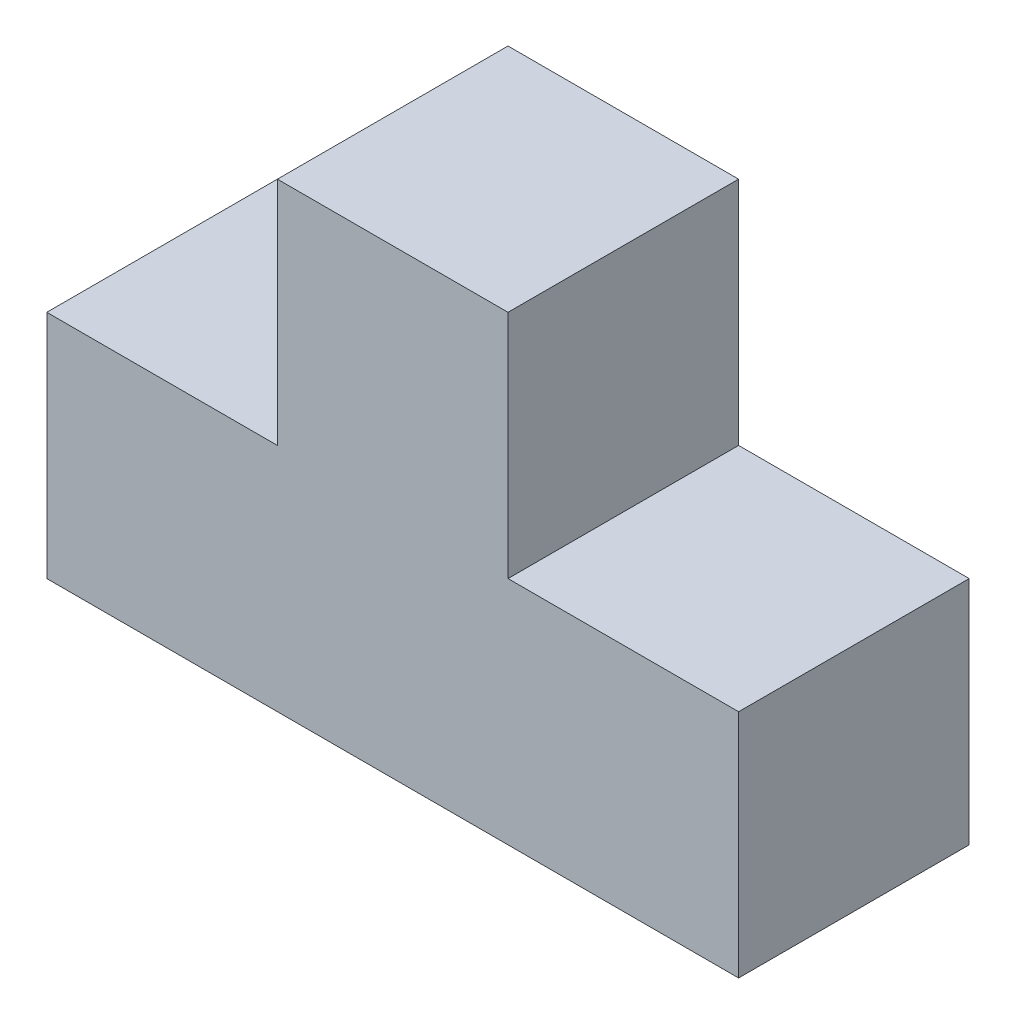
ISO-10303-21;
HEADER;
FILE_DESCRIPTION(('STEP AP214'),'2;1');
FILE_NAME('part.step','',(''),(''),'','','');
FILE_SCHEMA(('AUTOMOTIVE_DESIGN { 1 0 10303 214 1 1 1 1 }'));
ENDSEC;
DATA;
#1=APPLICATION_CONTEXT('core data for automotive mechanical design processes');
#2=APPLICATION_PROTOCOL_DEFINITION('international standard','automotive_design',2000,#1);
#3=PRODUCT_CONTEXT('',#1,'mechanical');
#4=PRODUCT('Part','Part','',(#3));
#5=PRODUCT_RELATED_PRODUCT_CATEGORY('part','',(#4));
#6=PRODUCT_DEFINITION_FORMATION('','',#4);
#7=PRODUCT_DEFINITION_CONTEXT('part definition',#1,'design');
#8=PRODUCT_DEFINITION('design','',#6,#7);
#9=PRODUCT_DEFINITION_SHAPE('','',#8);
#10=(LENGTH_UNIT() NAMED_UNIT(*) SI_UNIT(.MILLI.,.METRE.));
#11=(NAMED_UNIT(*) PLANE_ANGLE_UNIT() SI_UNIT($,.RADIAN.));
#12=(NAMED_UNIT(*) SI_UNIT($,.STERADIAN.) SOLID_ANGLE_UNIT());
#13=UNCERTAINTY_MEASURE_WITH_UNIT(LENGTH_MEASURE(1.E-05),#10,'distance_accuracy_value','');
#14=(GEOMETRIC_REPRESENTATION_CONTEXT(3) GLOBAL_UNCERTAINTY_ASSIGNED_CONTEXT((#13)) GLOBAL_UNIT_ASSIGNED_CONTEXT((#10,
#11,#12)) REPRESENTATION_CONTEXT('',''));
#15=CARTESIAN_POINT('',(0.,0.,0.));
#16=DIRECTION('',(0.,0.,1.));
#17=DIRECTION('',(1.,0.,0.));
#18=AXIS2_PLACEMENT_3D('',#15,#16,#17);
#19=CARTESIAN_POINT('',(-45.,30.,-15.));
#20=DIRECTION('',(-1.,0.,0.));
#21=DIRECTION('',(0.,0.,1.));
#22=AXIS2_PLACEMENT_3D('',#19,#20,#21);
#23=PLANE('',#22);
#24=DIRECTION('',(0.,0.,1.));
#25=VECTOR('',#24,1.);
#26=CARTESIAN_POINT('',(-45.,0.,-15.));
#27=LINE('',#26,#25);
#28=CARTESIAN_POINT('',(-45.,0.,-15.));
#29=VERTEX_POINT('',#28);
#30=CARTESIAN_POINT('',(-45.,0.,15.));
#31=VERTEX_POINT('',#30);
#32=EDGE_CURVE('E36',#29,#31,#27,.T.);
#33=ORIENTED_EDGE('',*,*,#32,.T.);
#34=DIRECTION('',(0.,-1.,0.));
#35=VECTOR('',#34,1.);
#36=CARTESIAN_POINT('',(-45.,30.,15.));
#37=LINE('',#36,#35);
#38=CARTESIAN_POINT('',(-45.,30.,15.));
#39=VERTEX_POINT('',#38);
#40=EDGE_CURVE('E97',#39,#31,#37,.T.);
#41=ORIENTED_EDGE('',*,*,#40,.F.);
#42=DIRECTION('',(0.,0.,1.));
#43=VECTOR('',#42,1.);
#44=CARTESIAN_POINT('',(-45.,30.,-15.));
#45=LINE('',#44,#43);
#46=CARTESIAN_POINT('',(-45.,30.,-15.));
#47=VERTEX_POINT('',#46);
#48=EDGE_CURVE('E11',#47,#39,#45,.T.);
#49=ORIENTED_EDGE('',*,*,#48,.F.);
#50=DIRECTION('',(0.,-1.,0.));
#51=VECTOR('',#50,1.);
#52=CARTESIAN_POINT('',(-45.,30.,-15.));
#53=LINE('',#52,#51);
#54=EDGE_CURVE('E98',#47,#29,#53,.T.);
#55=ORIENTED_EDGE('',*,*,#54,.T.);
#56=EDGE_LOOP('',(#33,#41,#49,#55));
#57=FACE_BOUND('',#56,.T.);
#58=ADVANCED_FACE('F33',(#57),#23,.T.);
#59=CARTESIAN_POINT('',(-15.,30.,-15.));
#60=DIRECTION('',(0.,1.,0.));
#61=DIRECTION('',(0.,0.,1.));
#62=AXIS2_PLACEMENT_3D('',#59,#60,#61);
#63=PLANE('',#62);
#64=ORIENTED_EDGE('',*,*,#48,.T.);
#65=DIRECTION('',(-1.,0.,0.));
#66=VECTOR('',#65,1.);
#67=CARTESIAN_POINT('',(-15.,30.,15.));
#68=LINE('',#67,#66);
#69=CARTESIAN_POINT('',(-15.,30.,15.));
#70=VERTEX_POINT('',#69);
#71=EDGE_CURVE('E115',#70,#39,#68,.T.);
#72=ORIENTED_EDGE('',*,*,#71,.F.);
#73=DIRECTION('',(0.,0.,1.));
#74=VECTOR('',#73,1.);
#75=CARTESIAN_POINT('',(-15.,30.,-15.));
#76=LINE('',#75,#74);
#77=CARTESIAN_POINT('',(-15.,30.,-15.));
#78=VERTEX_POINT('',#77);
#79=EDGE_CURVE('E41',#78,#70,#76,.T.);
#80=ORIENTED_EDGE('',*,*,#79,.F.);
#81=DIRECTION('',(-1.,0.,0.));
#82=VECTOR('',#81,1.);
#83=CARTESIAN_POINT('',(-15.,30.,-15.));
#84=LINE('',#83,#82);
#85=EDGE_CURVE('E103',#78,#47,#84,.T.);
#86=ORIENTED_EDGE('',*,*,#85,.T.);
#87=EDGE_LOOP('',(#64,#72,#80,#86));
#88=FACE_BOUND('',#87,.T.);
#89=ADVANCED_FACE('F179',(#88),#63,.T.);
#90=CARTESIAN_POINT('',(-15.,60.,-15.));
#91=DIRECTION('',(-1.,0.,0.));
#92=DIRECTION('',(0.,0.,1.));
#93=AXIS2_PLACEMENT_3D('',#90,#91,#92);
#94=PLANE('',#93);
#95=ORIENTED_EDGE('',*,*,#79,.T.);
#96=DIRECTION('',(0.,-1.,0.));
#97=VECTOR('',#96,1.);
#98=CARTESIAN_POINT('',(-15.,60.,15.));
#99=LINE('',#98,#97);
#100=CARTESIAN_POINT('',(-15.,60.,15.));
#101=VERTEX_POINT('',#100);
#102=EDGE_CURVE('E128',#101,#70,#99,.T.);
#103=ORIENTED_EDGE('',*,*,#102,.F.);
#104=DIRECTION('',(0.,0.,1.));
#105=VECTOR('',#104,1.);
#106=CARTESIAN_POINT('',(-15.,60.,-15.));
#107=LINE('',#106,#105);
#108=CARTESIAN_POINT('',(-15.,60.,-15.));
#109=VERTEX_POINT('',#108);
#110=EDGE_CURVE('E150',#109,#101,#107,.T.);
#111=ORIENTED_EDGE('',*,*,#110,.F.);
#112=DIRECTION('',(0.,-1.,0.));
#113=VECTOR('',#112,1.);
#114=CARTESIAN_POINT('',(-15.,60.,-15.));
#115=LINE('',#114,#113);
#116=EDGE_CURVE('E146',#109,#78,#115,.T.);
#117=ORIENTED_EDGE('',*,*,#116,.T.);
#118=EDGE_LOOP('',(#95,#103,#111,#117));
#119=FACE_BOUND('',#118,.T.);
#120=ADVANCED_FACE('F178',(#119),#94,.T.);
#121=CARTESIAN_POINT('',(15.,60.,-15.));
#122=DIRECTION('',(0.,1.,0.));
#123=DIRECTION('',(0.,0.,1.));
#124=AXIS2_PLACEMENT_3D('',#121,#122,#123);
#125=PLANE('',#124);
#126=ORIENTED_EDGE('',*,*,#110,.T.);
#127=DIRECTION('',(-1.,0.,0.));
#128=VECTOR('',#127,1.);
#129=CARTESIAN_POINT('',(15.,60.,15.));
#130=LINE('',#129,#128);
#131=CARTESIAN_POINT('',(15.,60.,15.));
#132=VERTEX_POINT('',#131);
#133=EDGE_CURVE('E125',#132,#101,#130,.T.);
#134=ORIENTED_EDGE('',*,*,#133,.F.);
#135=DIRECTION('',(0.,0.,1.));
#136=VECTOR('',#135,1.);
#137=CARTESIAN_POINT('',(15.,60.,-15.));
#138=LINE('',#137,#136);
#139=CARTESIAN_POINT('',(15.,60.,-15.));
#140=VERTEX_POINT('',#139);
#141=EDGE_CURVE('E152',#140,#132,#138,.T.);
#142=ORIENTED_EDGE('',*,*,#141,.F.);
#143=DIRECTION('',(-1.,0.,0.));
#144=VECTOR('',#143,1.);
#145=CARTESIAN_POINT('',(15.,60.,-15.));
#146=LINE('',#145,#144);
#147=EDGE_CURVE('E143',#140,#109,#146,.T.);
#148=ORIENTED_EDGE('',*,*,#147,.T.);
#149=EDGE_LOOP('',(#126,#134,#142,#148));
#150=FACE_BOUND('',#149,.T.);
#151=ADVANCED_FACE('F174',(#150),#125,.T.);
#152=CARTESIAN_POINT('',(15.,30.,-15.));
#153=DIRECTION('',(1.,0.,0.));
#154=DIRECTION('',(0.,0.,-1.));
#155=AXIS2_PLACEMENT_3D('',#152,#153,#154);
#156=PLANE('',#155);
#157=ORIENTED_EDGE('',*,*,#141,.T.);
#158=DIRECTION('',(0.,1.,0.));
#159=VECTOR('',#158,1.);
#160=CARTESIAN_POINT('',(15.,30.,15.));
#161=LINE('',#160,#159);
#162=CARTESIAN_POINT('',(15.,30.,15.));
#163=VERTEX_POINT('',#162);
#164=EDGE_CURVE('E122',#163,#132,#161,.T.);
#165=ORIENTED_EDGE('',*,*,#164,.F.);
#166=DIRECTION('',(0.,0.,1.));
#167=VECTOR('',#166,1.);
#168=CARTESIAN_POINT('',(15.,30.,-15.));
#169=LINE('',#168,#167);
#170=CARTESIAN_POINT('',(15.,30.,-15.));
#171=VERTEX_POINT('',#170);
#172=EDGE_CURVE('E154',#171,#163,#169,.T.);
#173=ORIENTED_EDGE('',*,*,#172,.F.);
#174=DIRECTION('',(0.,1.,0.));
#175=VECTOR('',#174,1.);
#176=CARTESIAN_POINT('',(15.,30.,-15.));
#177=LINE('',#176,#175);
#178=EDGE_CURVE('E140',#171,#140,#177,.T.);
#179=ORIENTED_EDGE('',*,*,#178,.T.);
#180=EDGE_LOOP('',(#157,#165,#173,#179));
#181=FACE_BOUND('',#180,.T.);
#182=ADVANCED_FACE('F167',(#181),#156,.T.);
#183=CARTESIAN_POINT('',(45.,30.,-15.));
#184=DIRECTION('',(0.,1.,0.));
#185=DIRECTION('',(0.,0.,1.));
#186=AXIS2_PLACEMENT_3D('',#183,#184,#185);
#187=PLANE('',#186);
#188=ORIENTED_EDGE('',*,*,#172,.T.);
#189=DIRECTION('',(-1.,0.,0.));
#190=VECTOR('',#189,1.);
#191=CARTESIAN_POINT('',(45.,30.,15.));
#192=LINE('',#191,#190);
#193=CARTESIAN_POINT('',(45.,30.,15.));
#194=VERTEX_POINT('',#193);
#195=EDGE_CURVE('E119',#194,#163,#192,.T.);
#196=ORIENTED_EDGE('',*,*,#195,.F.);
#197=DIRECTION('',(0.,0.,1.));
#198=VECTOR('',#197,1.);
#199=CARTESIAN_POINT('',(45.,30.,-15.));
#200=LINE('',#199,#198);
#201=CARTESIAN_POINT('',(45.,30.,-15.));
#202=VERTEX_POINT('',#201);
#203=EDGE_CURVE('E156',#202,#194,#200,.T.);
#204=ORIENTED_EDGE('',*,*,#203,.F.);
#205=DIRECTION('',(-1.,0.,0.));
#206=VECTOR('',#205,1.);
#207=CARTESIAN_POINT('',(45.,30.,-15.));
#208=LINE('',#207,#206);
#209=EDGE_CURVE('E137',#202,#171,#208,.T.);
#210=ORIENTED_EDGE('',*,*,#209,.T.);
#211=EDGE_LOOP('',(#188,#196,#204,#210));
#212=FACE_BOUND('',#211,.T.);
#213=ADVANCED_FACE('F164',(#212),#187,.T.);
#214=CARTESIAN_POINT('',(45.,0.,-15.));
#215=DIRECTION('',(1.,0.,0.));
#216=DIRECTION('',(0.,0.,-1.));
#217=AXIS2_PLACEMENT_3D('',#214,#215,#216);
#218=PLANE('',#217);
#219=ORIENTED_EDGE('',*,*,#203,.T.);
#220=DIRECTION('',(0.,1.,0.));
#221=VECTOR('',#220,1.);
#222=CARTESIAN_POINT('',(45.,0.,15.));
#223=LINE('',#222,#221);
#224=CARTESIAN_POINT('',(45.,0.,15.));
#225=VERTEX_POINT('',#224);
#226=EDGE_CURVE('E110',#225,#194,#223,.T.);
#227=ORIENTED_EDGE('',*,*,#226,.F.);
#228=DIRECTION('',(0.,0.,1.));
#229=VECTOR('',#228,1.);
#230=CARTESIAN_POINT('',(45.,0.,-15.));
#231=LINE('',#230,#229);
#232=CARTESIAN_POINT('',(45.,0.,-15.));
#233=VERTEX_POINT('',#232);
#234=EDGE_CURVE('E102',#233,#225,#231,.T.);
#235=ORIENTED_EDGE('',*,*,#234,.F.);
#236=DIRECTION('',(0.,1.,0.));
#237=VECTOR('',#236,1.);
#238=CARTESIAN_POINT('',(45.,0.,-15.));
#239=LINE('',#238,#237);
#240=EDGE_CURVE('E134',#233,#202,#239,.T.);
#241=ORIENTED_EDGE('',*,*,#240,.T.);
#242=EDGE_LOOP('',(#219,#227,#235,#241));
#243=FACE_BOUND('',#242,.T.);
#244=ADVANCED_FACE('F158',(#243),#218,.T.);
#245=CARTESIAN_POINT('',(-45.,0.,-15.));
#246=DIRECTION('',(0.,-1.,0.));
#247=DIRECTION('',(1.,0.,0.));
#248=AXIS2_PLACEMENT_3D('',#245,#246,#247);
#249=PLANE('',#248);
#250=ORIENTED_EDGE('',*,*,#234,.T.);
#251=DIRECTION('',(1.,0.,0.));
#252=VECTOR('',#251,1.);
#253=CARTESIAN_POINT('',(-45.,0.,15.));
#254=LINE('',#253,#252);
#255=EDGE_CURVE('E105',#31,#225,#254,.T.);
#256=ORIENTED_EDGE('',*,*,#255,.F.);
#257=ORIENTED_EDGE('',*,*,#32,.F.);
#258=DIRECTION('',(1.,0.,0.));
#259=VECTOR('',#258,1.);
#260=CARTESIAN_POINT('',(-45.,0.,-15.));
#261=LINE('',#260,#259);
#262=EDGE_CURVE('E132',#29,#233,#261,.T.);
#263=ORIENTED_EDGE('',*,*,#262,.T.);
#264=EDGE_LOOP('',(#250,#256,#257,#263));
#265=FACE_BOUND('',#264,.T.);
#266=ADVANCED_FACE('F106',(#265),#249,.T.);
#267=CARTESIAN_POINT('',(0.,0.,-15.));
#268=DIRECTION('',(0.,0.,1.));
#269=DIRECTION('',(1.,0.,0.));
#270=AXIS2_PLACEMENT_3D('',#267,#268,#269);
#271=PLANE('',#270);
#272=ORIENTED_EDGE('',*,*,#54,.F.);
#273=ORIENTED_EDGE('',*,*,#85,.F.);
#274=ORIENTED_EDGE('',*,*,#116,.F.);
#275=ORIENTED_EDGE('',*,*,#147,.F.);
#276=ORIENTED_EDGE('',*,*,#178,.F.);
#277=ORIENTED_EDGE('',*,*,#209,.F.);
#278=ORIENTED_EDGE('',*,*,#240,.F.);
#279=ORIENTED_EDGE('',*,*,#262,.F.);
#280=EDGE_LOOP('',(#272,#273,#274,#275,#276,#277,#278,#279));
#281=FACE_BOUND('',#280,.T.);
#282=ADVANCED_FACE('F170',(#281),#271,.F.);
#283=CARTESIAN_POINT('',(0.,0.,15.));
#284=DIRECTION('',(0.,0.,1.));
#285=DIRECTION('',(1.,0.,0.));
#286=AXIS2_PLACEMENT_3D('',#283,#284,#285);
#287=PLANE('',#286);
#288=ORIENTED_EDGE('',*,*,#40,.T.);
#289=ORIENTED_EDGE('',*,*,#255,.T.);
#290=ORIENTED_EDGE('',*,*,#226,.T.);
#291=ORIENTED_EDGE('',*,*,#195,.T.);
#292=ORIENTED_EDGE('',*,*,#164,.T.);
#293=ORIENTED_EDGE('',*,*,#133,.T.);
#294=ORIENTED_EDGE('',*,*,#102,.T.);
#295=ORIENTED_EDGE('',*,*,#71,.T.);
#296=EDGE_LOOP('',(#288,#289,#290,#291,#292,#293,#294,#295));
#297=FACE_BOUND('',#296,.T.);
#298=ADVANCED_FACE('F113',(#297),#287,.T.);
#299=CLOSED_SHELL('',(#58,#89,#120,#151,#182,#213,#244,#266,#282,#298));
#300=MANIFOLD_SOLID_BREP('B2',#299);
#301=ADVANCED_BREP_SHAPE_REPRESENTATION('',(#18,#300),#14);
#302=SHAPE_DEFINITION_REPRESENTATION(#9,#301);
ENDSEC;
END-ISO-10303-21;
